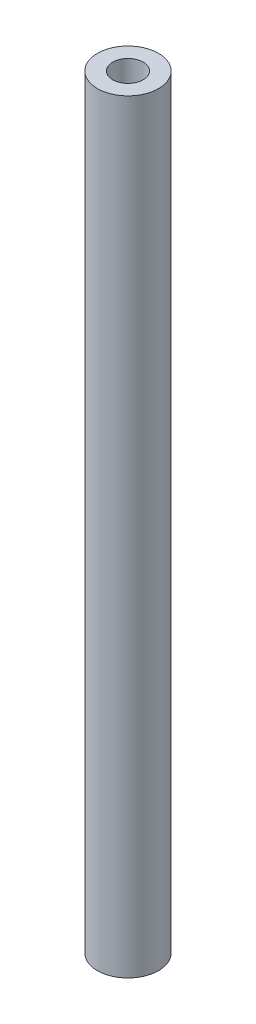
ISO-10303-21;
HEADER;
FILE_DESCRIPTION(('STEP AP214'),'2;1');
FILE_NAME('part.step','',(''),(''),'','','');
FILE_SCHEMA(('AUTOMOTIVE_DESIGN { 1 0 10303 214 1 1 1 1 }'));
ENDSEC;
DATA;
#1=APPLICATION_CONTEXT('core data for automotive mechanical design processes');
#2=APPLICATION_PROTOCOL_DEFINITION('international standard','automotive_design',2000,#1);
#3=PRODUCT_CONTEXT('',#1,'mechanical');
#4=PRODUCT('Part','Part','',(#3));
#5=PRODUCT_RELATED_PRODUCT_CATEGORY('part','',(#4));
#6=PRODUCT_DEFINITION_FORMATION('','',#4);
#7=PRODUCT_DEFINITION_CONTEXT('part definition',#1,'design');
#8=PRODUCT_DEFINITION('design','',#6,#7);
#9=PRODUCT_DEFINITION_SHAPE('','',#8);
#10=(LENGTH_UNIT() NAMED_UNIT(*) SI_UNIT(.MILLI.,.METRE.));
#11=(NAMED_UNIT(*) PLANE_ANGLE_UNIT() SI_UNIT($,.RADIAN.));
#12=(NAMED_UNIT(*) SI_UNIT($,.STERADIAN.) SOLID_ANGLE_UNIT());
#13=UNCERTAINTY_MEASURE_WITH_UNIT(LENGTH_MEASURE(1.E-05),#10,'distance_accuracy_value','');
#14=(GEOMETRIC_REPRESENTATION_CONTEXT(3) GLOBAL_UNCERTAINTY_ASSIGNED_CONTEXT((#13)) GLOBAL_UNIT_ASSIGNED_CONTEXT((#10,
#11,#12)) REPRESENTATION_CONTEXT('',''));
#15=CARTESIAN_POINT('',(0.,0.,0.));
#16=DIRECTION('',(0.,0.,1.));
#17=DIRECTION('',(1.,0.,0.));
#18=AXIS2_PLACEMENT_3D('',#15,#16,#17);
#19=CARTESIAN_POINT('',(0.,25.,0.));
#20=DIRECTION('',(0.,1.,0.));
#21=DIRECTION('',(0.,0.,1.));
#22=AXIS2_PLACEMENT_3D('',#19,#20,#21);
#23=PLANE('',#22);
#24=CARTESIAN_POINT('',(0.,25.,0.));
#25=DIRECTION('',(0.,1.,0.));
#26=DIRECTION('',(0.,0.,1.));
#27=AXIS2_PLACEMENT_3D('',#24,#25,#26);
#28=CIRCLE('',#27,2.);
#29=CARTESIAN_POINT('',(0.,25.,2.));
#30=VERTEX_POINT('',#29);
#31=EDGE_CURVE('E10',#30,#30,#28,.T.);
#32=ORIENTED_EDGE('',*,*,#31,.T.);
#33=EDGE_LOOP('',(#32));
#34=FACE_BOUND('',#33,.T.);
#35=CARTESIAN_POINT('',(0.,25.,0.));
#36=DIRECTION('',(0.,1.,0.));
#37=DIRECTION('',(0.,0.,1.));
#38=AXIS2_PLACEMENT_3D('',#35,#36,#37);
#39=CIRCLE('',#38,1.);
#40=CARTESIAN_POINT('',(0.,25.,1.));
#41=VERTEX_POINT('',#40);
#42=EDGE_CURVE('E50',#41,#41,#39,.T.);
#43=ORIENTED_EDGE('',*,*,#42,.F.);
#44=EDGE_LOOP('',(#43));
#45=FACE_BOUND('',#44,.T.);
#46=ADVANCED_FACE('F37',(#34,#45),#23,.T.);
#47=CARTESIAN_POINT('',(0.,-25.,0.));
#48=DIRECTION('',(0.,1.,0.));
#49=DIRECTION('',(0.,0.,1.));
#50=AXIS2_PLACEMENT_3D('',#47,#48,#49);
#51=PLANE('',#50);
#52=CARTESIAN_POINT('',(0.,-25.,0.));
#53=DIRECTION('',(0.,1.,0.));
#54=DIRECTION('',(0.,0.,1.));
#55=AXIS2_PLACEMENT_3D('',#52,#53,#54);
#56=CIRCLE('',#55,2.);
#57=CARTESIAN_POINT('',(0.,-25.,2.));
#58=VERTEX_POINT('',#57);
#59=EDGE_CURVE('E41',#58,#58,#56,.T.);
#60=ORIENTED_EDGE('',*,*,#59,.F.);
#61=EDGE_LOOP('',(#60));
#62=FACE_BOUND('',#61,.T.);
#63=CARTESIAN_POINT('',(0.,-25.,0.));
#64=DIRECTION('',(0.,1.,0.));
#65=DIRECTION('',(0.,0.,1.));
#66=AXIS2_PLACEMENT_3D('',#63,#64,#65);
#67=CIRCLE('',#66,1.);
#68=CARTESIAN_POINT('',(0.,-25.,1.));
#69=VERTEX_POINT('',#68);
#70=EDGE_CURVE('E52',#69,#69,#67,.T.);
#71=ORIENTED_EDGE('',*,*,#70,.T.);
#72=EDGE_LOOP('',(#71));
#73=FACE_BOUND('',#72,.T.);
#74=ADVANCED_FACE('F64',(#62,#73),#51,.F.);
#75=CARTESIAN_POINT('',(0.,25.,0.));
#76=DIRECTION('',(0.,-1.,0.));
#77=DIRECTION('',(0.,0.,-1.));
#78=AXIS2_PLACEMENT_3D('',#75,#76,#77);
#79=CYLINDRICAL_SURFACE('',#78,2.);
#80=ORIENTED_EDGE('',*,*,#31,.F.);
#81=EDGE_LOOP('',(#80));
#82=FACE_BOUND('',#81,.T.);
#83=ORIENTED_EDGE('',*,*,#59,.T.);
#84=EDGE_LOOP('',(#83));
#85=FACE_BOUND('',#84,.T.);
#86=ADVANCED_FACE('F39',(#82,#85),#79,.T.);
#87=CARTESIAN_POINT('',(0.,25.,0.));
#88=DIRECTION('',(0.,-1.,0.));
#89=DIRECTION('',(0.,0.,-1.));
#90=AXIS2_PLACEMENT_3D('',#87,#88,#89);
#91=CYLINDRICAL_SURFACE('',#90,1.);
#92=ORIENTED_EDGE('',*,*,#42,.T.);
#93=EDGE_LOOP('',(#92));
#94=FACE_BOUND('',#93,.T.);
#95=ORIENTED_EDGE('',*,*,#70,.F.);
#96=EDGE_LOOP('',(#95));
#97=FACE_BOUND('',#96,.T.);
#98=ADVANCED_FACE('F60',(#94,#97),#91,.F.);
#99=CLOSED_SHELL('',(#46,#74,#86,#98));
#100=MANIFOLD_SOLID_BREP('B2',#99);
#101=ADVANCED_BREP_SHAPE_REPRESENTATION('',(#18,#100),#14);
#102=SHAPE_DEFINITION_REPRESENTATION(#9,#101);
ENDSEC;
END-ISO-10303-21;
